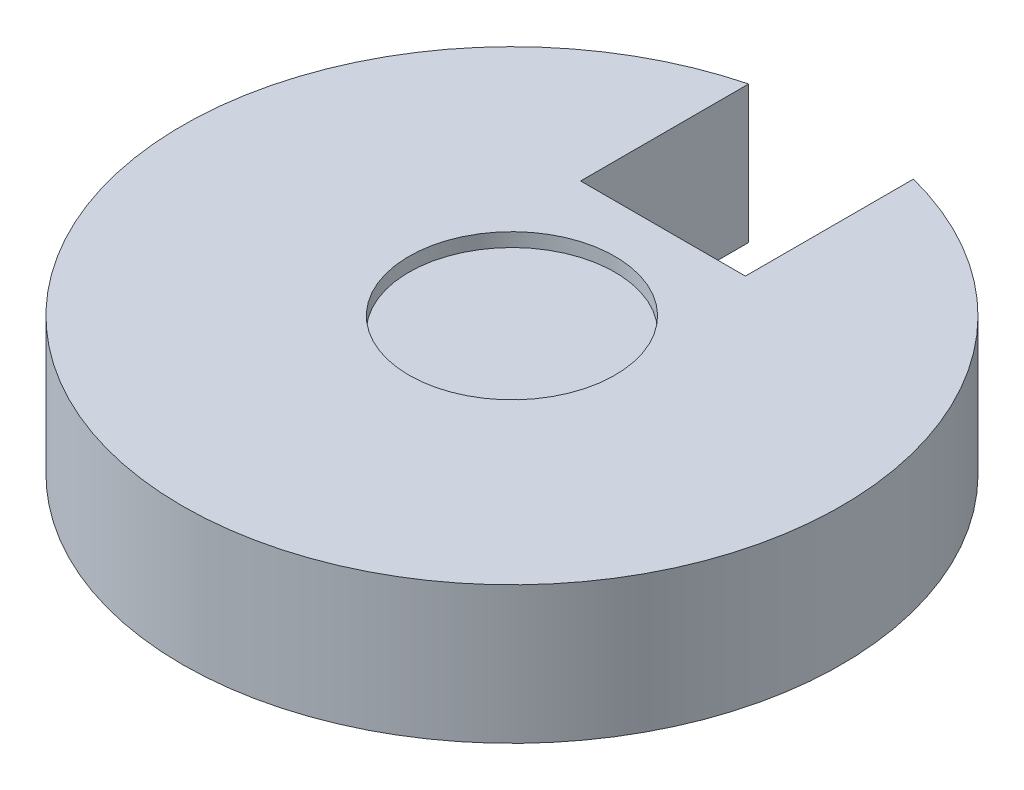
ISO-10303-21;
HEADER;
FILE_DESCRIPTION(('STEP AP214'),'2;1');
FILE_NAME('part.step','',(''),(''),'','','');
FILE_SCHEMA(('AUTOMOTIVE_DESIGN { 1 0 10303 214 1 1 1 1 }'));
ENDSEC;
DATA;
#1=APPLICATION_CONTEXT('core data for automotive mechanical design processes');
#2=APPLICATION_PROTOCOL_DEFINITION('international standard','automotive_design',2000,#1);
#3=PRODUCT_CONTEXT('',#1,'mechanical');
#4=PRODUCT('Part','Part','',(#3));
#5=PRODUCT_RELATED_PRODUCT_CATEGORY('part','',(#4));
#6=PRODUCT_DEFINITION_FORMATION('','',#4);
#7=PRODUCT_DEFINITION_CONTEXT('part definition',#1,'design');
#8=PRODUCT_DEFINITION('design','',#6,#7);
#9=PRODUCT_DEFINITION_SHAPE('','',#8);
#10=(LENGTH_UNIT() NAMED_UNIT(*) SI_UNIT(.MILLI.,.METRE.));
#11=(NAMED_UNIT(*) PLANE_ANGLE_UNIT() SI_UNIT($,.RADIAN.));
#12=(NAMED_UNIT(*) SI_UNIT($,.STERADIAN.) SOLID_ANGLE_UNIT());
#13=UNCERTAINTY_MEASURE_WITH_UNIT(LENGTH_MEASURE(1.E-05),#10,'distance_accuracy_value','');
#14=(GEOMETRIC_REPRESENTATION_CONTEXT(3) GLOBAL_UNCERTAINTY_ASSIGNED_CONTEXT((#13)) GLOBAL_UNIT_ASSIGNED_CONTEXT((#10,
#11,#12)) REPRESENTATION_CONTEXT('',''));
#15=CARTESIAN_POINT('',(0.,0.,0.));
#16=DIRECTION('',(0.,0.,1.));
#17=DIRECTION('',(1.,0.,0.));
#18=AXIS2_PLACEMENT_3D('',#15,#16,#17);
#19=CARTESIAN_POINT('',(-6.,10.,0.));
#20=DIRECTION('',(-1.,0.,0.));
#21=DIRECTION('',(0.,0.,1.));
#22=AXIS2_PLACEMENT_3D('',#19,#20,#21);
#23=PLANE('',#22);
#24=DIRECTION('',(0.,0.,-1.));
#25=VECTOR('',#24,1.);
#26=CARTESIAN_POINT('',(-6.,0.,0.));
#27=LINE('',#26,#25);
#28=CARTESIAN_POINT('',(-6.,0.,-11.));
#29=VERTEX_POINT('',#28);
#30=CARTESIAN_POINT('',(-6.,0.,-23.2379000772445));
#31=VERTEX_POINT('',#30);
#32=EDGE_CURVE('E118',#29,#31,#27,.T.);
#33=ORIENTED_EDGE('',*,*,#32,.T.);
#34=DIRECTION('',(0.,-1.,0.));
#35=VECTOR('',#34,1.);
#36=CARTESIAN_POINT('',(-6.,10.,-23.2379000772445));
#37=LINE('',#36,#35);
#38=CARTESIAN_POINT('',(-6.,10.,-23.2379000772445));
#39=VERTEX_POINT('',#38);
#40=EDGE_CURVE('E52',#39,#31,#37,.T.);
#41=ORIENTED_EDGE('',*,*,#40,.F.);
#42=DIRECTION('',(0.,0.,-1.));
#43=VECTOR('',#42,1.);
#44=CARTESIAN_POINT('',(-6.,10.,0.));
#45=LINE('',#44,#43);
#46=CARTESIAN_POINT('',(-6.,10.,-11.));
#47=VERTEX_POINT('',#46);
#48=EDGE_CURVE('E93',#47,#39,#45,.T.);
#49=ORIENTED_EDGE('',*,*,#48,.F.);
#50=DIRECTION('',(0.,-1.,0.));
#51=VECTOR('',#50,1.);
#52=CARTESIAN_POINT('',(-6.,10.,-11.));
#53=LINE('',#52,#51);
#54=EDGE_CURVE('E117',#47,#29,#53,.T.);
#55=ORIENTED_EDGE('',*,*,#54,.T.);
#56=EDGE_LOOP('',(#33,#41,#49,#55));
#57=FACE_BOUND('',#56,.T.);
#58=ADVANCED_FACE('F43',(#57),#23,.F.);
#59=CARTESIAN_POINT('',(0.,10.,0.));
#60=DIRECTION('',(0.,-1.,0.));
#61=DIRECTION('',(0.,0.,-1.));
#62=AXIS2_PLACEMENT_3D('',#59,#60,#61);
#63=CYLINDRICAL_SURFACE('',#62,24.);
#64=CARTESIAN_POINT('',(0.,0.,0.));
#65=DIRECTION('',(0.,1.,0.));
#66=DIRECTION('',(0.,0.,1.));
#67=AXIS2_PLACEMENT_3D('',#64,#65,#66);
#68=CIRCLE('',#67,24.);
#69=CARTESIAN_POINT('',(6.,0.,-23.2379000772445));
#70=VERTEX_POINT('',#69);
#71=EDGE_CURVE('E100',#31,#70,#68,.T.);
#72=ORIENTED_EDGE('',*,*,#71,.T.);
#73=DIRECTION('',(0.,-1.,0.));
#74=VECTOR('',#73,1.);
#75=CARTESIAN_POINT('',(6.,10.,-23.2379000772445));
#76=LINE('',#75,#74);
#77=CARTESIAN_POINT('',(6.,10.,-23.2379000772445));
#78=VERTEX_POINT('',#77);
#79=EDGE_CURVE('E98',#78,#70,#76,.T.);
#80=ORIENTED_EDGE('',*,*,#79,.F.);
#81=CARTESIAN_POINT('',(0.,10.,0.));
#82=DIRECTION('',(0.,1.,0.));
#83=DIRECTION('',(0.,0.,1.));
#84=AXIS2_PLACEMENT_3D('',#81,#82,#83);
#85=CIRCLE('',#84,24.);
#86=EDGE_CURVE('E87',#39,#78,#85,.T.);
#87=ORIENTED_EDGE('',*,*,#86,.F.);
#88=ORIENTED_EDGE('',*,*,#40,.T.);
#89=EDGE_LOOP('',(#72,#80,#87,#88));
#90=FACE_BOUND('',#89,.T.);
#91=ADVANCED_FACE('F99',(#90),#63,.T.);
#92=CARTESIAN_POINT('',(6.,10.,0.));
#93=DIRECTION('',(-1.,0.,0.));
#94=DIRECTION('',(0.,0.,1.));
#95=AXIS2_PLACEMENT_3D('',#92,#93,#94);
#96=PLANE('',#95);
#97=DIRECTION('',(0.,0.,-1.));
#98=VECTOR('',#97,1.);
#99=CARTESIAN_POINT('',(6.,0.,0.));
#100=LINE('',#99,#98);
#101=CARTESIAN_POINT('',(6.,0.,-11.));
#102=VERTEX_POINT('',#101);
#103=EDGE_CURVE('E124',#102,#70,#100,.T.);
#104=ORIENTED_EDGE('',*,*,#103,.F.);
#105=DIRECTION('',(0.,-1.,0.));
#106=VECTOR('',#105,1.);
#107=CARTESIAN_POINT('',(6.,10.,-11.));
#108=LINE('',#107,#106);
#109=CARTESIAN_POINT('',(6.,10.,-11.));
#110=VERTEX_POINT('',#109);
#111=EDGE_CURVE('E76',#110,#102,#108,.T.);
#112=ORIENTED_EDGE('',*,*,#111,.F.);
#113=DIRECTION('',(0.,0.,-1.));
#114=VECTOR('',#113,1.);
#115=CARTESIAN_POINT('',(6.,10.,0.));
#116=LINE('',#115,#114);
#117=EDGE_CURVE('E91',#110,#78,#116,.T.);
#118=ORIENTED_EDGE('',*,*,#117,.T.);
#119=ORIENTED_EDGE('',*,*,#79,.T.);
#120=EDGE_LOOP('',(#104,#112,#118,#119));
#121=FACE_BOUND('',#120,.T.);
#122=ADVANCED_FACE('F106',(#121),#96,.T.);
#123=CARTESIAN_POINT('',(0.,10.,-11.));
#124=DIRECTION('',(0.,0.,1.));
#125=DIRECTION('',(1.,0.,0.));
#126=AXIS2_PLACEMENT_3D('',#123,#124,#125);
#127=PLANE('',#126);
#128=DIRECTION('',(-1.,0.,0.));
#129=VECTOR('',#128,1.);
#130=CARTESIAN_POINT('',(0.,0.,-11.));
#131=LINE('',#130,#129);
#132=EDGE_CURVE('E79',#102,#29,#131,.T.);
#133=ORIENTED_EDGE('',*,*,#132,.T.);
#134=ORIENTED_EDGE('',*,*,#54,.F.);
#135=DIRECTION('',(-1.,0.,0.));
#136=VECTOR('',#135,1.);
#137=CARTESIAN_POINT('',(0.,10.,-11.));
#138=LINE('',#137,#136);
#139=EDGE_CURVE('E60',#110,#47,#138,.T.);
#140=ORIENTED_EDGE('',*,*,#139,.F.);
#141=ORIENTED_EDGE('',*,*,#111,.T.);
#142=EDGE_LOOP('',(#133,#134,#140,#141));
#143=FACE_BOUND('',#142,.T.);
#144=ADVANCED_FACE('F156',(#143),#127,.F.);
#145=CARTESIAN_POINT('',(0.,10.,0.));
#146=DIRECTION('',(0.,-1.,0.));
#147=DIRECTION('',(0.,0.,-1.));
#148=AXIS2_PLACEMENT_3D('',#145,#146,#147);
#149=CYLINDRICAL_SURFACE('',#148,7.5);
#150=CARTESIAN_POINT('',(0.,9.,0.));
#151=DIRECTION('',(0.,1.,0.));
#152=DIRECTION('',(0.,0.,1.));
#153=AXIS2_PLACEMENT_3D('',#150,#151,#152);
#154=CIRCLE('',#153,7.5);
#155=CARTESIAN_POINT('',(0.,9.,7.5));
#156=VERTEX_POINT('',#155);
#157=EDGE_CURVE('E11',#156,#156,#154,.T.);
#158=ORIENTED_EDGE('',*,*,#157,.F.);
#159=EDGE_LOOP('',(#158));
#160=FACE_BOUND('',#159,.T.);
#161=CARTESIAN_POINT('',(0.,10.,0.));
#162=DIRECTION('',(0.,1.,0.));
#163=DIRECTION('',(0.,0.,1.));
#164=AXIS2_PLACEMENT_3D('',#161,#162,#163);
#165=CIRCLE('',#164,7.5);
#166=CARTESIAN_POINT('',(0.,10.,7.5));
#167=VERTEX_POINT('',#166);
#168=EDGE_CURVE('E110',#167,#167,#165,.T.);
#169=ORIENTED_EDGE('',*,*,#168,.T.);
#170=EDGE_LOOP('',(#169));
#171=FACE_BOUND('',#170,.T.);
#172=ADVANCED_FACE('F146',(#160,#171),#149,.F.);
#173=CARTESIAN_POINT('',(0.,10.,0.));
#174=DIRECTION('',(0.,1.,0.));
#175=DIRECTION('',(0.,0.,1.));
#176=AXIS2_PLACEMENT_3D('',#173,#174,#175);
#177=PLANE('',#176);
#178=ORIENTED_EDGE('',*,*,#48,.T.);
#179=ORIENTED_EDGE('',*,*,#86,.T.);
#180=ORIENTED_EDGE('',*,*,#117,.F.);
#181=ORIENTED_EDGE('',*,*,#139,.T.);
#182=EDGE_LOOP('',(#178,#179,#180,#181));
#183=FACE_BOUND('',#182,.T.);
#184=ORIENTED_EDGE('',*,*,#168,.F.);
#185=EDGE_LOOP('',(#184));
#186=FACE_BOUND('',#185,.T.);
#187=ADVANCED_FACE('F88',(#183,#186),#177,.T.);
#188=CARTESIAN_POINT('',(0.,0.,0.));
#189=DIRECTION('',(0.,1.,0.));
#190=DIRECTION('',(0.,0.,1.));
#191=AXIS2_PLACEMENT_3D('',#188,#189,#190);
#192=PLANE('',#191);
#193=ORIENTED_EDGE('',*,*,#32,.F.);
#194=ORIENTED_EDGE('',*,*,#132,.F.);
#195=ORIENTED_EDGE('',*,*,#103,.T.);
#196=ORIENTED_EDGE('',*,*,#71,.F.);
#197=EDGE_LOOP('',(#193,#194,#195,#196));
#198=FACE_BOUND('',#197,.T.);
#199=ADVANCED_FACE('F136',(#198),#192,.F.);
#200=CARTESIAN_POINT('',(0.,9.,0.));
#201=DIRECTION('',(0.,1.,0.));
#202=DIRECTION('',(0.,0.,1.));
#203=AXIS2_PLACEMENT_3D('',#200,#201,#202);
#204=PLANE('',#203);
#205=ORIENTED_EDGE('',*,*,#157,.T.);
#206=EDGE_LOOP('',(#205));
#207=FACE_BOUND('',#206,.T.);
#208=ADVANCED_FACE('F138',(#207),#204,.T.);
#209=CLOSED_SHELL('',(#58,#91,#122,#144,#172,#187,#199,#208));
#210=MANIFOLD_SOLID_BREP('B2',#209);
#211=ADVANCED_BREP_SHAPE_REPRESENTATION('',(#18,#210),#14);
#212=SHAPE_DEFINITION_REPRESENTATION(#9,#211);
ENDSEC;
END-ISO-10303-21;
